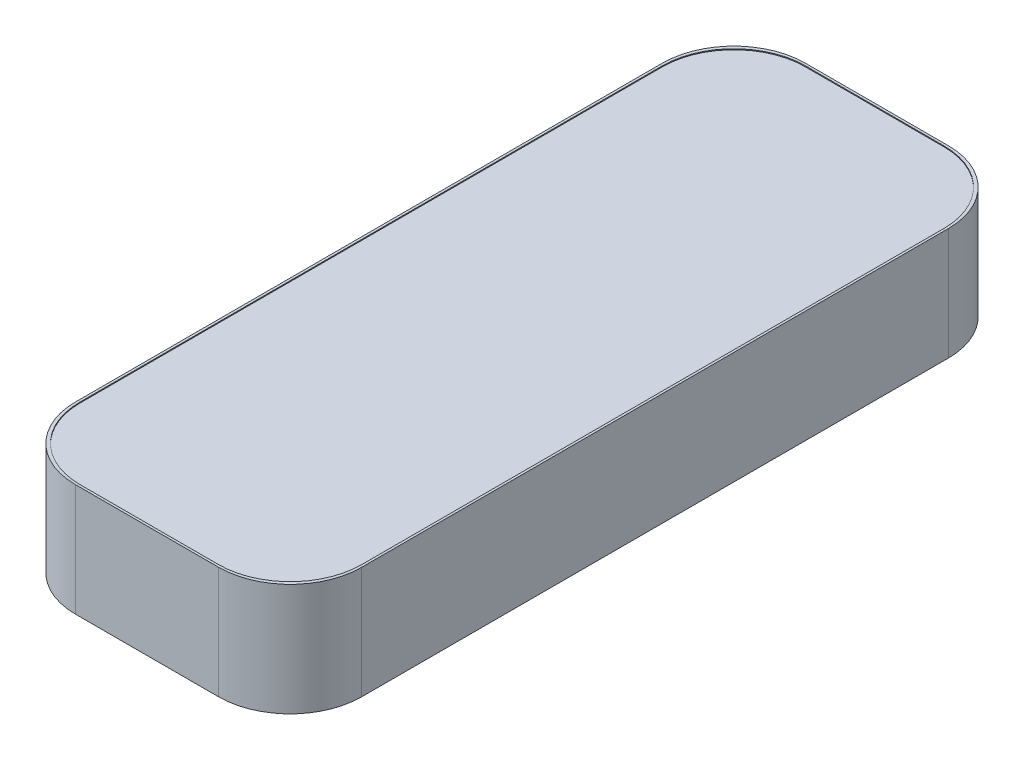
ISO-10303-21;
HEADER;
FILE_DESCRIPTION(('STEP AP214'),'2;1');
FILE_NAME('part.step','',(''),(''),'','','');
FILE_SCHEMA(('AUTOMOTIVE_DESIGN { 1 0 10303 214 1 1 1 1 }'));
ENDSEC;
DATA;
#1=APPLICATION_CONTEXT('core data for automotive mechanical design processes');
#2=APPLICATION_PROTOCOL_DEFINITION('international standard','automotive_design',2000,#1);
#3=PRODUCT_CONTEXT('',#1,'mechanical');
#4=PRODUCT('Part','Part','',(#3));
#5=PRODUCT_RELATED_PRODUCT_CATEGORY('part','',(#4));
#6=PRODUCT_DEFINITION_FORMATION('','',#4);
#7=PRODUCT_DEFINITION_CONTEXT('part definition',#1,'design');
#8=PRODUCT_DEFINITION('design','',#6,#7);
#9=PRODUCT_DEFINITION_SHAPE('','',#8);
#10=(LENGTH_UNIT() NAMED_UNIT(*) SI_UNIT(.MILLI.,.METRE.));
#11=(NAMED_UNIT(*) PLANE_ANGLE_UNIT() SI_UNIT($,.RADIAN.));
#12=(NAMED_UNIT(*) SI_UNIT($,.STERADIAN.) SOLID_ANGLE_UNIT());
#13=UNCERTAINTY_MEASURE_WITH_UNIT(LENGTH_MEASURE(1.E-05),#10,'distance_accuracy_value','');
#14=(GEOMETRIC_REPRESENTATION_CONTEXT(3) GLOBAL_UNCERTAINTY_ASSIGNED_CONTEXT((#13)) GLOBAL_UNIT_ASSIGNED_CONTEXT((#10,
#11,#12)) REPRESENTATION_CONTEXT('',''));
#15=CARTESIAN_POINT('',(0.,0.,0.));
#16=DIRECTION('',(0.,0.,1.));
#17=DIRECTION('',(1.,0.,0.));
#18=AXIS2_PLACEMENT_3D('',#15,#16,#17);
#19=CARTESIAN_POINT('',(-15.875,0.,-40.48125));
#20=DIRECTION('',(0.,-1.,0.));
#21=DIRECTION('',(0.,0.,-1.));
#22=AXIS2_PLACEMENT_3D('',#19,#20,#21);
#23=PLANE('',#22);
#24=DIRECTION('',(1.,0.,0.));
#25=VECTOR('',#24,1.);
#26=CARTESIAN_POINT('',(-23.8125,0.,0.));
#27=LINE('',#26,#25);
#28=CARTESIAN_POINT('',(-23.8125,0.,0.));
#29=VERTEX_POINT('',#28);
#30=CARTESIAN_POINT('',(-7.9375,0.,0.));
#31=VERTEX_POINT('',#30);
#32=EDGE_CURVE('E26',#29,#31,#27,.T.);
#33=ORIENTED_EDGE('',*,*,#32,.F.);
#34=CARTESIAN_POINT('',(-23.8125,0.,-7.9375));
#35=DIRECTION('',(0.,1.,0.));
#36=DIRECTION('',(-1.,0.,0.));
#37=AXIS2_PLACEMENT_3D('',#34,#35,#36);
#38=CIRCLE('',#37,7.9375);
#39=CARTESIAN_POINT('',(-31.75,0.,-7.9375));
#40=VERTEX_POINT('',#39);
#41=EDGE_CURVE('E278',#40,#29,#38,.T.);
#42=ORIENTED_EDGE('',*,*,#41,.F.);
#43=DIRECTION('',(0.,0.,1.));
#44=VECTOR('',#43,1.);
#45=CARTESIAN_POINT('',(-31.75,0.,-73.025));
#46=LINE('',#45,#44);
#47=CARTESIAN_POINT('',(-31.75,0.,-73.025));
#48=VERTEX_POINT('',#47);
#49=EDGE_CURVE('E322',#48,#40,#46,.T.);
#50=ORIENTED_EDGE('',*,*,#49,.F.);
#51=CARTESIAN_POINT('',(-23.8125,0.,-73.025));
#52=DIRECTION('',(0.,1.,0.));
#53=DIRECTION('',(0.,0.,-1.));
#54=AXIS2_PLACEMENT_3D('',#51,#52,#53);
#55=CIRCLE('',#54,7.9375);
#56=CARTESIAN_POINT('',(-23.8125,0.,-80.9625));
#57=VERTEX_POINT('',#56);
#58=EDGE_CURVE('E223',#57,#48,#55,.T.);
#59=ORIENTED_EDGE('',*,*,#58,.F.);
#60=DIRECTION('',(-1.,0.,0.));
#61=VECTOR('',#60,1.);
#62=CARTESIAN_POINT('',(-7.9375,0.,-80.9625));
#63=LINE('',#62,#61);
#64=CARTESIAN_POINT('',(-7.9375,0.,-80.9625));
#65=VERTEX_POINT('',#64);
#66=EDGE_CURVE('E215',#65,#57,#63,.T.);
#67=ORIENTED_EDGE('',*,*,#66,.F.);
#68=CARTESIAN_POINT('',(-7.9375,0.,-73.025));
#69=DIRECTION('',(0.,1.,0.));
#70=DIRECTION('',(1.,0.,0.));
#71=AXIS2_PLACEMENT_3D('',#68,#69,#70);
#72=CIRCLE('',#71,7.9375);
#73=CARTESIAN_POINT('',(0.,0.,-73.025));
#74=VERTEX_POINT('',#73);
#75=EDGE_CURVE('E198',#74,#65,#72,.T.);
#76=ORIENTED_EDGE('',*,*,#75,.F.);
#77=DIRECTION('',(0.,0.,-1.));
#78=VECTOR('',#77,1.);
#79=CARTESIAN_POINT('',(0.,0.,-7.9375));
#80=LINE('',#79,#78);
#81=CARTESIAN_POINT('',(0.,0.,-7.9375));
#82=VERTEX_POINT('',#81);
#83=EDGE_CURVE('E332',#82,#74,#80,.T.);
#84=ORIENTED_EDGE('',*,*,#83,.F.);
#85=CARTESIAN_POINT('',(-7.9375,0.,-7.9375));
#86=DIRECTION('',(0.,1.,0.));
#87=DIRECTION('',(0.,0.,1.));
#88=AXIS2_PLACEMENT_3D('',#85,#86,#87);
#89=CIRCLE('',#88,7.9375);
#90=EDGE_CURVE('E248',#31,#82,#89,.T.);
#91=ORIENTED_EDGE('',*,*,#90,.F.);
#92=EDGE_LOOP('',(#33,#42,#50,#59,#67,#76,#84,#91));
#93=FACE_BOUND('',#92,.T.);
#94=CARTESIAN_POINT('',(-23.5585,0.,-8.1915));
#95=DIRECTION('',(0.,1.,0.));
#96=DIRECTION('',(0.,0.,-1.));
#97=AXIS2_PLACEMENT_3D('',#94,#95,#96);
#98=CIRCLE('',#97,7.9375);
#99=CARTESIAN_POINT('',(-31.496,0.,-8.1915));
#100=VERTEX_POINT('',#99);
#101=CARTESIAN_POINT('',(-23.5585,0.,-0.253999999999995));
#102=VERTEX_POINT('',#101);
#103=EDGE_CURVE('E351',#100,#102,#98,.T.);
#104=ORIENTED_EDGE('',*,*,#103,.T.);
#105=DIRECTION('',(1.,0.,0.));
#106=VECTOR('',#105,1.);
#107=CARTESIAN_POINT('',(-12.03325,0.,-0.253999999999995));
#108=LINE('',#107,#106);
#109=CARTESIAN_POINT('',(-8.1915,0.,-0.253999999999995));
#110=VERTEX_POINT('',#109);
#111=EDGE_CURVE('E342',#102,#110,#108,.T.);
#112=ORIENTED_EDGE('',*,*,#111,.T.);
#113=CARTESIAN_POINT('',(-8.1915,0.,-8.1915));
#114=DIRECTION('',(0.,1.,0.));
#115=DIRECTION('',(-1.,0.,0.));
#116=AXIS2_PLACEMENT_3D('',#113,#114,#115);
#117=CIRCLE('',#116,7.9375);
#118=CARTESIAN_POINT('',(-0.254,0.,-8.1915));
#119=VERTEX_POINT('',#118);
#120=EDGE_CURVE('E284',#110,#119,#117,.T.);
#121=ORIENTED_EDGE('',*,*,#120,.T.);
#122=DIRECTION('',(0.,0.,-1.));
#123=VECTOR('',#122,1.);
#124=CARTESIAN_POINT('',(-0.254,0.,-56.626125));
#125=LINE('',#124,#123);
#126=CARTESIAN_POINT('',(-0.254,0.,-72.771));
#127=VERTEX_POINT('',#126);
#128=EDGE_CURVE('E257',#119,#127,#125,.T.);
#129=ORIENTED_EDGE('',*,*,#128,.T.);
#130=CARTESIAN_POINT('',(-8.1915,0.,-72.771));
#131=DIRECTION('',(0.,1.,0.));
#132=DIRECTION('',(0.,0.,1.));
#133=AXIS2_PLACEMENT_3D('',#130,#131,#132);
#134=CIRCLE('',#133,7.9375);
#135=CARTESIAN_POINT('',(-8.1915,0.,-80.7085));
#136=VERTEX_POINT('',#135);
#137=EDGE_CURVE('E236',#127,#136,#134,.T.);
#138=ORIENTED_EDGE('',*,*,#137,.T.);
#139=DIRECTION('',(-1.,0.,0.));
#140=VECTOR('',#139,1.);
#141=CARTESIAN_POINT('',(-19.71675,0.,-80.7085));
#142=LINE('',#141,#140);
#143=CARTESIAN_POINT('',(-23.5585,0.,-80.7085));
#144=VERTEX_POINT('',#143);
#145=EDGE_CURVE('E301',#136,#144,#142,.T.);
#146=ORIENTED_EDGE('',*,*,#145,.T.);
#147=CARTESIAN_POINT('',(-23.5585,0.,-72.771));
#148=DIRECTION('',(0.,1.,0.));
#149=DIRECTION('',(1.,0.,0.));
#150=AXIS2_PLACEMENT_3D('',#147,#148,#149);
#151=CIRCLE('',#150,7.9375);
#152=CARTESIAN_POINT('',(-31.496,0.,-72.771));
#153=VERTEX_POINT('',#152);
#154=EDGE_CURVE('E317',#144,#153,#151,.T.);
#155=ORIENTED_EDGE('',*,*,#154,.T.);
#156=DIRECTION('',(0.,0.,1.));
#157=VECTOR('',#156,1.);
#158=CARTESIAN_POINT('',(-31.496,0.,-24.336375));
#159=LINE('',#158,#157);
#160=EDGE_CURVE('E258',#153,#100,#159,.T.);
#161=ORIENTED_EDGE('',*,*,#160,.T.);
#162=EDGE_LOOP('',(#104,#112,#121,#129,#138,#146,#155,#161));
#163=FACE_BOUND('',#162,.T.);
#164=ADVANCED_FACE('F15',(#93,#163),#23,.T.);
#165=CARTESIAN_POINT('',(-15.875,12.446,-40.48125));
#166=DIRECTION('',(0.,-1.,0.));
#167=DIRECTION('',(0.,0.,-1.));
#168=AXIS2_PLACEMENT_3D('',#165,#166,#167);
#169=PLANE('',#168);
#170=DIRECTION('',(1.,0.,0.));
#171=VECTOR('',#170,1.);
#172=CARTESIAN_POINT('',(-23.8125,12.446,0.));
#173=LINE('',#172,#171);
#174=CARTESIAN_POINT('',(-23.8125,12.446,0.));
#175=VERTEX_POINT('',#174);
#176=CARTESIAN_POINT('',(-7.9375,12.446,0.));
#177=VERTEX_POINT('',#176);
#178=EDGE_CURVE('E10',#175,#177,#173,.T.);
#179=ORIENTED_EDGE('',*,*,#178,.T.);
#180=CARTESIAN_POINT('',(-7.9375,12.446,-7.9375));
#181=DIRECTION('',(0.,1.,0.));
#182=DIRECTION('',(0.,0.,1.));
#183=AXIS2_PLACEMENT_3D('',#180,#181,#182);
#184=CIRCLE('',#183,7.9375);
#185=CARTESIAN_POINT('',(0.,12.446,-7.9375));
#186=VERTEX_POINT('',#185);
#187=EDGE_CURVE('E245',#177,#186,#184,.T.);
#188=ORIENTED_EDGE('',*,*,#187,.T.);
#189=DIRECTION('',(0.,0.,-1.));
#190=VECTOR('',#189,1.);
#191=CARTESIAN_POINT('',(0.,12.446,-7.9375));
#192=LINE('',#191,#190);
#193=CARTESIAN_POINT('',(0.,12.446,-73.025));
#194=VERTEX_POINT('',#193);
#195=EDGE_CURVE('E384',#186,#194,#192,.T.);
#196=ORIENTED_EDGE('',*,*,#195,.T.);
#197=CARTESIAN_POINT('',(-7.9375,12.446,-73.025));
#198=DIRECTION('',(0.,1.,0.));
#199=DIRECTION('',(1.,0.,0.));
#200=AXIS2_PLACEMENT_3D('',#197,#198,#199);
#201=CIRCLE('',#200,7.9375);
#202=CARTESIAN_POINT('',(-7.9375,12.446,-80.9625));
#203=VERTEX_POINT('',#202);
#204=EDGE_CURVE('E210',#194,#203,#201,.T.);
#205=ORIENTED_EDGE('',*,*,#204,.T.);
#206=DIRECTION('',(-1.,0.,0.));
#207=VECTOR('',#206,1.);
#208=CARTESIAN_POINT('',(-7.9375,12.446,-80.9625));
#209=LINE('',#208,#207);
#210=CARTESIAN_POINT('',(-23.8125,12.446,-80.9625));
#211=VERTEX_POINT('',#210);
#212=EDGE_CURVE('E217',#203,#211,#209,.T.);
#213=ORIENTED_EDGE('',*,*,#212,.T.);
#214=CARTESIAN_POINT('',(-23.8125,12.446,-73.025));
#215=DIRECTION('',(0.,1.,0.));
#216=DIRECTION('',(0.,0.,-1.));
#217=AXIS2_PLACEMENT_3D('',#214,#215,#216);
#218=CIRCLE('',#217,7.9375);
#219=CARTESIAN_POINT('',(-31.75,12.446,-73.025));
#220=VERTEX_POINT('',#219);
#221=EDGE_CURVE('E233',#211,#220,#218,.T.);
#222=ORIENTED_EDGE('',*,*,#221,.T.);
#223=DIRECTION('',(0.,0.,1.));
#224=VECTOR('',#223,1.);
#225=CARTESIAN_POINT('',(-31.75,12.446,-73.025));
#226=LINE('',#225,#224);
#227=CARTESIAN_POINT('',(-31.75,12.446,-7.9375));
#228=VERTEX_POINT('',#227);
#229=EDGE_CURVE('E318',#220,#228,#226,.T.);
#230=ORIENTED_EDGE('',*,*,#229,.T.);
#231=CARTESIAN_POINT('',(-23.8125,12.446,-7.9375));
#232=DIRECTION('',(0.,1.,0.));
#233=DIRECTION('',(-1.,0.,0.));
#234=AXIS2_PLACEMENT_3D('',#231,#232,#233);
#235=CIRCLE('',#234,7.9375);
#236=EDGE_CURVE('E392',#228,#175,#235,.T.);
#237=ORIENTED_EDGE('',*,*,#236,.T.);
#238=EDGE_LOOP('',(#179,#188,#196,#205,#213,#222,#230,#237));
#239=FACE_BOUND('',#238,.T.);
#240=CARTESIAN_POINT('',(-23.5585,12.446,-72.771));
#241=DIRECTION('',(0.,-1.,0.));
#242=DIRECTION('',(0.,0.,-1.));
#243=AXIS2_PLACEMENT_3D('',#240,#241,#242);
#244=CIRCLE('',#243,7.9375);
#245=CARTESIAN_POINT('',(-31.496,12.446,-72.771));
#246=VERTEX_POINT('',#245);
#247=CARTESIAN_POINT('',(-23.5585,12.446,-80.7085));
#248=VERTEX_POINT('',#247);
#249=EDGE_CURVE('E307',#246,#248,#244,.T.);
#250=ORIENTED_EDGE('',*,*,#249,.T.);
#251=DIRECTION('',(1.,0.,0.));
#252=VECTOR('',#251,1.);
#253=CARTESIAN_POINT('',(-19.71675,12.446,-80.7085));
#254=LINE('',#253,#252);
#255=CARTESIAN_POINT('',(-8.1915,12.446,-80.7085));
#256=VERTEX_POINT('',#255);
#257=EDGE_CURVE('E252',#248,#256,#254,.T.);
#258=ORIENTED_EDGE('',*,*,#257,.T.);
#259=CARTESIAN_POINT('',(-8.1915,12.446,-72.771));
#260=DIRECTION('',(0.,-1.,0.));
#261=DIRECTION('',(1.,0.,0.));
#262=AXIS2_PLACEMENT_3D('',#259,#260,#261);
#263=CIRCLE('',#262,7.9375);
#264=CARTESIAN_POINT('',(-0.254,12.446,-72.771));
#265=VERTEX_POINT('',#264);
#266=EDGE_CURVE('E364',#256,#265,#263,.T.);
#267=ORIENTED_EDGE('',*,*,#266,.T.);
#268=DIRECTION('',(0.,0.,1.));
#269=VECTOR('',#268,1.);
#270=CARTESIAN_POINT('',(-0.254,12.446,-56.626125));
#271=LINE('',#270,#269);
#272=CARTESIAN_POINT('',(-0.254,12.446,-8.1915));
#273=VERTEX_POINT('',#272);
#274=EDGE_CURVE('E152',#265,#273,#271,.T.);
#275=ORIENTED_EDGE('',*,*,#274,.T.);
#276=CARTESIAN_POINT('',(-8.1915,12.446,-8.1915));
#277=DIRECTION('',(0.,-1.,0.));
#278=DIRECTION('',(0.,0.,1.));
#279=AXIS2_PLACEMENT_3D('',#276,#277,#278);
#280=CIRCLE('',#279,7.9375);
#281=CARTESIAN_POINT('',(-8.1915,12.446,-0.254));
#282=VERTEX_POINT('',#281);
#283=EDGE_CURVE('E405',#273,#282,#280,.T.);
#284=ORIENTED_EDGE('',*,*,#283,.T.);
#285=DIRECTION('',(-1.,0.,0.));
#286=VECTOR('',#285,1.);
#287=CARTESIAN_POINT('',(-12.03325,12.446,-0.254));
#288=LINE('',#287,#286);
#289=CARTESIAN_POINT('',(-23.5585,12.446,-0.254));
#290=VERTEX_POINT('',#289);
#291=EDGE_CURVE('E325',#282,#290,#288,.T.);
#292=ORIENTED_EDGE('',*,*,#291,.T.);
#293=CARTESIAN_POINT('',(-23.5585,12.446,-8.1915));
#294=DIRECTION('',(0.,-1.,0.));
#295=DIRECTION('',(-1.,0.,0.));
#296=AXIS2_PLACEMENT_3D('',#293,#294,#295);
#297=CIRCLE('',#296,7.9375);
#298=CARTESIAN_POINT('',(-31.496,12.446,-8.1915));
#299=VERTEX_POINT('',#298);
#300=EDGE_CURVE('E241',#290,#299,#297,.T.);
#301=ORIENTED_EDGE('',*,*,#300,.T.);
#302=DIRECTION('',(0.,0.,-1.));
#303=VECTOR('',#302,1.);
#304=CARTESIAN_POINT('',(-31.496,12.446,-24.336375));
#305=LINE('',#304,#303);
#306=EDGE_CURVE('E352',#299,#246,#305,.T.);
#307=ORIENTED_EDGE('',*,*,#306,.T.);
#308=EDGE_LOOP('',(#250,#258,#267,#275,#284,#292,#301,#307));
#309=FACE_BOUND('',#308,.T.);
#310=ADVANCED_FACE('F478',(#239,#309),#169,.F.);
#311=CARTESIAN_POINT('',(-23.8125,0.,0.));
#312=DIRECTION('',(0.,0.,1.));
#313=DIRECTION('',(1.,0.,0.));
#314=AXIS2_PLACEMENT_3D('',#311,#312,#313);
#315=PLANE('',#314);
#316=ORIENTED_EDGE('',*,*,#32,.T.);
#317=DIRECTION('',(0.,1.,0.));
#318=VECTOR('',#317,1.);
#319=CARTESIAN_POINT('',(-7.9375,0.,0.));
#320=LINE('',#319,#318);
#321=EDGE_CURVE('E247',#31,#177,#320,.T.);
#322=ORIENTED_EDGE('',*,*,#321,.T.);
#323=ORIENTED_EDGE('',*,*,#178,.F.);
#324=DIRECTION('',(0.,1.,0.));
#325=VECTOR('',#324,1.);
#326=CARTESIAN_POINT('',(-23.8125,0.,0.));
#327=LINE('',#326,#325);
#328=EDGE_CURVE('E282',#29,#175,#327,.T.);
#329=ORIENTED_EDGE('',*,*,#328,.F.);
#330=EDGE_LOOP('',(#316,#322,#323,#329));
#331=FACE_BOUND('',#330,.T.);
#332=ADVANCED_FACE('F518',(#331),#315,.T.);
#333=CARTESIAN_POINT('',(-7.9375,0.,-7.9375));
#334=DIRECTION('',(0.,-1.,0.));
#335=DIRECTION('',(0.,0.,1.));
#336=AXIS2_PLACEMENT_3D('',#333,#334,#335);
#337=CYLINDRICAL_SURFACE('',#336,7.9375);
#338=ORIENTED_EDGE('',*,*,#90,.T.);
#339=DIRECTION('',(0.,1.,0.));
#340=VECTOR('',#339,1.);
#341=CARTESIAN_POINT('',(0.,0.,-7.9375));
#342=LINE('',#341,#340);
#343=EDGE_CURVE('E268',#82,#186,#342,.T.);
#344=ORIENTED_EDGE('',*,*,#343,.T.);
#345=ORIENTED_EDGE('',*,*,#187,.F.);
#346=ORIENTED_EDGE('',*,*,#321,.F.);
#347=EDGE_LOOP('',(#338,#344,#345,#346));
#348=FACE_BOUND('',#347,.T.);
#349=ADVANCED_FACE('F524',(#348),#337,.T.);
#350=CARTESIAN_POINT('',(0.,0.,-7.9375));
#351=DIRECTION('',(1.,0.,0.));
#352=DIRECTION('',(0.,0.,-1.));
#353=AXIS2_PLACEMENT_3D('',#350,#351,#352);
#354=PLANE('',#353);
#355=ORIENTED_EDGE('',*,*,#83,.T.);
#356=DIRECTION('',(0.,1.,0.));
#357=VECTOR('',#356,1.);
#358=CARTESIAN_POINT('',(0.,0.,-73.025));
#359=LINE('',#358,#357);
#360=EDGE_CURVE('E205',#74,#194,#359,.T.);
#361=ORIENTED_EDGE('',*,*,#360,.T.);
#362=ORIENTED_EDGE('',*,*,#195,.F.);
#363=ORIENTED_EDGE('',*,*,#343,.F.);
#364=EDGE_LOOP('',(#355,#361,#362,#363));
#365=FACE_BOUND('',#364,.T.);
#366=ADVANCED_FACE('F691',(#365),#354,.T.);
#367=CARTESIAN_POINT('',(-7.9375,0.,-73.025));
#368=DIRECTION('',(0.,-1.,0.));
#369=DIRECTION('',(1.,0.,0.));
#370=AXIS2_PLACEMENT_3D('',#367,#368,#369);
#371=CYLINDRICAL_SURFACE('',#370,7.9375);
#372=ORIENTED_EDGE('',*,*,#75,.T.);
#373=DIRECTION('',(0.,1.,0.));
#374=VECTOR('',#373,1.);
#375=CARTESIAN_POINT('',(-7.9375,0.,-80.9625));
#376=LINE('',#375,#374);
#377=EDGE_CURVE('E202',#65,#203,#376,.T.);
#378=ORIENTED_EDGE('',*,*,#377,.T.);
#379=ORIENTED_EDGE('',*,*,#204,.F.);
#380=ORIENTED_EDGE('',*,*,#360,.F.);
#381=EDGE_LOOP('',(#372,#378,#379,#380));
#382=FACE_BOUND('',#381,.T.);
#383=ADVANCED_FACE('F200',(#382),#371,.T.);
#384=CARTESIAN_POINT('',(-7.9375,0.,-80.9625));
#385=DIRECTION('',(0.,0.,-1.));
#386=DIRECTION('',(-1.,0.,0.));
#387=AXIS2_PLACEMENT_3D('',#384,#385,#386);
#388=PLANE('',#387);
#389=ORIENTED_EDGE('',*,*,#66,.T.);
#390=DIRECTION('',(0.,1.,0.));
#391=VECTOR('',#390,1.);
#392=CARTESIAN_POINT('',(-23.8125,0.,-80.9625));
#393=LINE('',#392,#391);
#394=EDGE_CURVE('E225',#57,#211,#393,.T.);
#395=ORIENTED_EDGE('',*,*,#394,.T.);
#396=ORIENTED_EDGE('',*,*,#212,.F.);
#397=ORIENTED_EDGE('',*,*,#377,.F.);
#398=EDGE_LOOP('',(#389,#395,#396,#397));
#399=FACE_BOUND('',#398,.T.);
#400=ADVANCED_FACE('F213',(#399),#388,.T.);
#401=CARTESIAN_POINT('',(-23.8125,0.,-73.025));
#402=DIRECTION('',(0.,-1.,0.));
#403=DIRECTION('',(0.,0.,-1.));
#404=AXIS2_PLACEMENT_3D('',#401,#402,#403);
#405=CYLINDRICAL_SURFACE('',#404,7.9375);
#406=ORIENTED_EDGE('',*,*,#58,.T.);
#407=DIRECTION('',(0.,1.,0.));
#408=VECTOR('',#407,1.);
#409=CARTESIAN_POINT('',(-31.75,0.,-73.025));
#410=LINE('',#409,#408);
#411=EDGE_CURVE('E321',#48,#220,#410,.T.);
#412=ORIENTED_EDGE('',*,*,#411,.T.);
#413=ORIENTED_EDGE('',*,*,#221,.F.);
#414=ORIENTED_EDGE('',*,*,#394,.F.);
#415=EDGE_LOOP('',(#406,#412,#413,#414));
#416=FACE_BOUND('',#415,.T.);
#417=ADVANCED_FACE('F625',(#416),#405,.T.);
#418=CARTESIAN_POINT('',(-31.75,0.,-73.025));
#419=DIRECTION('',(-1.,0.,0.));
#420=DIRECTION('',(0.,0.,1.));
#421=AXIS2_PLACEMENT_3D('',#418,#419,#420);
#422=PLANE('',#421);
#423=ORIENTED_EDGE('',*,*,#49,.T.);
#424=DIRECTION('',(0.,1.,0.));
#425=VECTOR('',#424,1.);
#426=CARTESIAN_POINT('',(-31.75,0.,-7.9375));
#427=LINE('',#426,#425);
#428=EDGE_CURVE('E427',#40,#228,#427,.T.);
#429=ORIENTED_EDGE('',*,*,#428,.T.);
#430=ORIENTED_EDGE('',*,*,#229,.F.);
#431=ORIENTED_EDGE('',*,*,#411,.F.);
#432=EDGE_LOOP('',(#423,#429,#430,#431));
#433=FACE_BOUND('',#432,.T.);
#434=DIRECTION('',(0.,0.,-1.));
#435=VECTOR('',#434,1.);
#436=CARTESIAN_POINT('',(-31.75,5.08,-43.6414119668617));
#437=LINE('',#436,#435);
#438=CARTESIAN_POINT('',(-31.75,5.08,-14.2578239337234));
#439=VERTEX_POINT('',#438);
#440=CARTESIAN_POINT('',(-31.75,5.08,-19.0203239337234));
#441=VERTEX_POINT('',#440);
#442=EDGE_CURVE('E334',#439,#441,#437,.T.);
#443=ORIENTED_EDGE('',*,*,#442,.T.);
#444=CARTESIAN_POINT('',(-31.75,5.87375,-19.0203239337234));
#445=DIRECTION('',(1.,0.,0.));
#446=DIRECTION('',(0.,-1.,0.));
#447=AXIS2_PLACEMENT_3D('',#444,#445,#446);
#448=CIRCLE('',#447,0.793749999999989);
#449=CARTESIAN_POINT('',(-31.75,6.6675,-19.0203239337234));
#450=VERTEX_POINT('',#449);
#451=EDGE_CURVE('E347',#441,#450,#448,.T.);
#452=ORIENTED_EDGE('',*,*,#451,.T.);
#453=DIRECTION('',(0.,0.,1.));
#454=VECTOR('',#453,1.);
#455=CARTESIAN_POINT('',(-31.75,6.6675,-46.0226619668617));
#456=LINE('',#455,#454);
#457=CARTESIAN_POINT('',(-31.75,6.6675,-14.2578239337234));
#458=VERTEX_POINT('',#457);
#459=EDGE_CURVE('E276',#450,#458,#456,.T.);
#460=ORIENTED_EDGE('',*,*,#459,.T.);
#461=CARTESIAN_POINT('',(-31.75,5.87375,-14.2578239337234));
#462=DIRECTION('',(1.,0.,0.));
#463=DIRECTION('',(0.,0.,-1.));
#464=AXIS2_PLACEMENT_3D('',#461,#462,#463);
#465=CIRCLE('',#464,0.793749999999989);
#466=EDGE_CURVE('E262',#458,#439,#465,.T.);
#467=ORIENTED_EDGE('',*,*,#466,.T.);
#468=EDGE_LOOP('',(#443,#452,#460,#467));
#469=FACE_BOUND('',#468,.T.);
#470=ADVANCED_FACE('F616',(#433,#469),#422,.T.);
#471=CARTESIAN_POINT('',(-23.8125,0.,-7.9375));
#472=DIRECTION('',(0.,-1.,0.));
#473=DIRECTION('',(-1.,0.,0.));
#474=AXIS2_PLACEMENT_3D('',#471,#472,#473);
#475=CYLINDRICAL_SURFACE('',#474,7.9375);
#476=ORIENTED_EDGE('',*,*,#41,.T.);
#477=ORIENTED_EDGE('',*,*,#328,.T.);
#478=ORIENTED_EDGE('',*,*,#236,.F.);
#479=ORIENTED_EDGE('',*,*,#428,.F.);
#480=EDGE_LOOP('',(#476,#477,#478,#479));
#481=FACE_BOUND('',#480,.T.);
#482=ADVANCED_FACE('F611',(#481),#475,.T.);
#483=CARTESIAN_POINT('',(-15.875,12.3444,-40.48125));
#484=DIRECTION('',(0.,1.,0.));
#485=DIRECTION('',(0.,0.,1.));
#486=AXIS2_PLACEMENT_3D('',#483,#484,#485);
#487=PLANE('',#486);
#488=DIRECTION('',(1.,0.,0.));
#489=VECTOR('',#488,1.);
#490=CARTESIAN_POINT('',(-8.1915,12.3444,-80.7085));
#491=LINE('',#490,#489);
#492=CARTESIAN_POINT('',(-23.5585,12.3444,-80.7085));
#493=VERTEX_POINT('',#492);
#494=CARTESIAN_POINT('',(-8.1915,12.3444,-80.7085));
#495=VERTEX_POINT('',#494);
#496=EDGE_CURVE('E283',#493,#495,#491,.T.);
#497=ORIENTED_EDGE('',*,*,#496,.F.);
#498=CARTESIAN_POINT('',(-23.5585,12.3444,-72.771));
#499=DIRECTION('',(0.,-1.,0.));
#500=DIRECTION('',(0.,0.,-1.));
#501=AXIS2_PLACEMENT_3D('',#498,#499,#500);
#502=CIRCLE('',#501,7.9375);
#503=CARTESIAN_POINT('',(-31.496,12.3444,-72.771));
#504=VERTEX_POINT('',#503);
#505=EDGE_CURVE('E306',#504,#493,#502,.T.);
#506=ORIENTED_EDGE('',*,*,#505,.F.);
#507=DIRECTION('',(0.,0.,-1.));
#508=VECTOR('',#507,1.);
#509=CARTESIAN_POINT('',(-31.496,12.3444,-72.771));
#510=LINE('',#509,#508);
#511=CARTESIAN_POINT('',(-31.496,12.3444,-8.1915));
#512=VERTEX_POINT('',#511);
#513=EDGE_CURVE('E244',#512,#504,#510,.T.);
#514=ORIENTED_EDGE('',*,*,#513,.F.);
#515=CARTESIAN_POINT('',(-23.5585,12.3444,-8.1915));
#516=DIRECTION('',(0.,-1.,0.));
#517=DIRECTION('',(-1.,0.,0.));
#518=AXIS2_PLACEMENT_3D('',#515,#516,#517);
#519=CIRCLE('',#518,7.9375);
#520=CARTESIAN_POINT('',(-23.5585,12.3444,-0.253999999999995));
#521=VERTEX_POINT('',#520);
#522=EDGE_CURVE('E327',#521,#512,#519,.T.);
#523=ORIENTED_EDGE('',*,*,#522,.F.);
#524=DIRECTION('',(-1.,0.,0.));
#525=VECTOR('',#524,1.);
#526=CARTESIAN_POINT('',(-23.5585,12.3444,-0.254));
#527=LINE('',#526,#525);
#528=CARTESIAN_POINT('',(-8.1915,12.3444,-0.253999999999995));
#529=VERTEX_POINT('',#528);
#530=EDGE_CURVE('E406',#529,#521,#527,.T.);
#531=ORIENTED_EDGE('',*,*,#530,.F.);
#532=CARTESIAN_POINT('',(-8.1915,12.3444,-8.1915));
#533=DIRECTION('',(0.,-1.,0.));
#534=DIRECTION('',(0.,0.,1.));
#535=AXIS2_PLACEMENT_3D('',#532,#533,#534);
#536=CIRCLE('',#535,7.9375);
#537=CARTESIAN_POINT('',(-0.254,12.3444,-8.1915));
#538=VERTEX_POINT('',#537);
#539=EDGE_CURVE('E160',#538,#529,#536,.T.);
#540=ORIENTED_EDGE('',*,*,#539,.F.);
#541=DIRECTION('',(0.,0.,1.));
#542=VECTOR('',#541,1.);
#543=CARTESIAN_POINT('',(-0.254,12.3444,-8.1915));
#544=LINE('',#543,#542);
#545=CARTESIAN_POINT('',(-0.254,12.3444,-72.771));
#546=VERTEX_POINT('',#545);
#547=EDGE_CURVE('E312',#546,#538,#544,.T.);
#548=ORIENTED_EDGE('',*,*,#547,.F.);
#549=CARTESIAN_POINT('',(-8.1915,12.3444,-72.771));
#550=DIRECTION('',(0.,-1.,0.));
#551=DIRECTION('',(1.,0.,0.));
#552=AXIS2_PLACEMENT_3D('',#549,#550,#551);
#553=CIRCLE('',#552,7.9375);
#554=EDGE_CURVE('E249',#495,#546,#553,.T.);
#555=ORIENTED_EDGE('',*,*,#554,.F.);
#556=EDGE_LOOP('',(#497,#506,#514,#523,#531,#540,#548,#555));
#557=FACE_BOUND('',#556,.T.);
#558=ADVANCED_FACE('F511',(#557),#487,.T.);
#559=CARTESIAN_POINT('',(-23.5585,12.446,-80.7085));
#560=DIRECTION('',(0.,0.,-1.));
#561=DIRECTION('',(1.,0.,0.));
#562=AXIS2_PLACEMENT_3D('',#559,#560,#561);
#563=PLANE('',#562);
#564=ORIENTED_EDGE('',*,*,#257,.F.);
#565=DIRECTION('',(0.,-1.,0.));
#566=VECTOR('',#565,1.);
#567=CARTESIAN_POINT('',(-23.5585,12.446,-80.7085));
#568=LINE('',#567,#566);
#569=EDGE_CURVE('E354',#248,#493,#568,.T.);
#570=ORIENTED_EDGE('',*,*,#569,.T.);
#571=ORIENTED_EDGE('',*,*,#496,.T.);
#572=DIRECTION('',(0.,-1.,0.));
#573=VECTOR('',#572,1.);
#574=CARTESIAN_POINT('',(-8.1915,12.446,-80.7085));
#575=LINE('',#574,#573);
#576=EDGE_CURVE('E253',#256,#495,#575,.T.);
#577=ORIENTED_EDGE('',*,*,#576,.F.);
#578=EDGE_LOOP('',(#564,#570,#571,#577));
#579=FACE_BOUND('',#578,.T.);
#580=ADVANCED_FACE('F509',(#579),#563,.F.);
#581=CARTESIAN_POINT('',(-8.1915,12.446,-72.771));
#582=DIRECTION('',(0.,1.,0.));
#583=DIRECTION('',(1.,0.,0.));
#584=AXIS2_PLACEMENT_3D('',#581,#582,#583);
#585=CYLINDRICAL_SURFACE('',#584,7.9375);
#586=ORIENTED_EDGE('',*,*,#266,.F.);
#587=ORIENTED_EDGE('',*,*,#576,.T.);
#588=ORIENTED_EDGE('',*,*,#554,.T.);
#589=DIRECTION('',(0.,-1.,0.));
#590=VECTOR('',#589,1.);
#591=CARTESIAN_POINT('',(-0.254,12.446,-72.771));
#592=LINE('',#591,#590);
#593=EDGE_CURVE('E308',#265,#546,#592,.T.);
#594=ORIENTED_EDGE('',*,*,#593,.F.);
#595=EDGE_LOOP('',(#586,#587,#588,#594));
#596=FACE_BOUND('',#595,.T.);
#597=ADVANCED_FACE('F481',(#596),#585,.F.);
#598=CARTESIAN_POINT('',(-0.254,12.446,-72.771));
#599=DIRECTION('',(1.,0.,0.));
#600=DIRECTION('',(0.,0.,1.));
#601=AXIS2_PLACEMENT_3D('',#598,#599,#600);
#602=PLANE('',#601);
#603=ORIENTED_EDGE('',*,*,#274,.F.);
#604=ORIENTED_EDGE('',*,*,#593,.T.);
#605=ORIENTED_EDGE('',*,*,#547,.T.);
#606=DIRECTION('',(0.,-1.,0.));
#607=VECTOR('',#606,1.);
#608=CARTESIAN_POINT('',(-0.254,12.446,-8.1915));
#609=LINE('',#608,#607);
#610=EDGE_CURVE('E271',#273,#538,#609,.T.);
#611=ORIENTED_EDGE('',*,*,#610,.F.);
#612=EDGE_LOOP('',(#603,#604,#605,#611));
#613=FACE_BOUND('',#612,.T.);
#614=ADVANCED_FACE('F485',(#613),#602,.F.);
#615=CARTESIAN_POINT('',(-8.1915,12.446,-8.1915));
#616=DIRECTION('',(0.,1.,0.));
#617=DIRECTION('',(0.,0.,1.));
#618=AXIS2_PLACEMENT_3D('',#615,#616,#617);
#619=CYLINDRICAL_SURFACE('',#618,7.9375);
#620=ORIENTED_EDGE('',*,*,#283,.F.);
#621=ORIENTED_EDGE('',*,*,#610,.T.);
#622=ORIENTED_EDGE('',*,*,#539,.T.);
#623=DIRECTION('',(0.,-1.,0.));
#624=VECTOR('',#623,1.);
#625=CARTESIAN_POINT('',(-8.1915,12.446,-0.254));
#626=LINE('',#625,#624);
#627=EDGE_CURVE('E19',#282,#529,#626,.T.);
#628=ORIENTED_EDGE('',*,*,#627,.F.);
#629=EDGE_LOOP('',(#620,#621,#622,#628));
#630=FACE_BOUND('',#629,.T.);
#631=ADVANCED_FACE('F487',(#630),#619,.F.);
#632=CARTESIAN_POINT('',(-8.1915,12.446,-0.254));
#633=DIRECTION('',(0.,0.,1.));
#634=DIRECTION('',(-1.,0.,0.));
#635=AXIS2_PLACEMENT_3D('',#632,#633,#634);
#636=PLANE('',#635);
#637=ORIENTED_EDGE('',*,*,#291,.F.);
#638=ORIENTED_EDGE('',*,*,#627,.T.);
#639=ORIENTED_EDGE('',*,*,#530,.T.);
#640=DIRECTION('',(0.,-1.,0.));
#641=VECTOR('',#640,1.);
#642=CARTESIAN_POINT('',(-23.5585,12.446,-0.254));
#643=LINE('',#642,#641);
#644=EDGE_CURVE('E243',#290,#521,#643,.T.);
#645=ORIENTED_EDGE('',*,*,#644,.F.);
#646=EDGE_LOOP('',(#637,#638,#639,#645));
#647=FACE_BOUND('',#646,.T.);
#648=ADVANCED_FACE('F494',(#647),#636,.F.);
#649=CARTESIAN_POINT('',(-23.5585,12.446,-8.1915));
#650=DIRECTION('',(0.,1.,0.));
#651=DIRECTION('',(-1.,0.,0.));
#652=AXIS2_PLACEMENT_3D('',#649,#650,#651);
#653=CYLINDRICAL_SURFACE('',#652,7.9375);
#654=ORIENTED_EDGE('',*,*,#300,.F.);
#655=ORIENTED_EDGE('',*,*,#644,.T.);
#656=ORIENTED_EDGE('',*,*,#522,.T.);
#657=DIRECTION('',(0.,-1.,0.));
#658=VECTOR('',#657,1.);
#659=CARTESIAN_POINT('',(-31.496,12.446,-8.1915));
#660=LINE('',#659,#658);
#661=EDGE_CURVE('E330',#299,#512,#660,.T.);
#662=ORIENTED_EDGE('',*,*,#661,.F.);
#663=EDGE_LOOP('',(#654,#655,#656,#662));
#664=FACE_BOUND('',#663,.T.);
#665=ADVANCED_FACE('F497',(#664),#653,.F.);
#666=CARTESIAN_POINT('',(-31.496,12.446,-8.1915));
#667=DIRECTION('',(-1.,0.,0.));
#668=DIRECTION('',(0.,0.,-1.));
#669=AXIS2_PLACEMENT_3D('',#666,#667,#668);
#670=PLANE('',#669);
#671=ORIENTED_EDGE('',*,*,#306,.F.);
#672=ORIENTED_EDGE('',*,*,#661,.T.);
#673=ORIENTED_EDGE('',*,*,#513,.T.);
#674=DIRECTION('',(0.,-1.,0.));
#675=VECTOR('',#674,1.);
#676=CARTESIAN_POINT('',(-31.496,12.446,-72.771));
#677=LINE('',#676,#675);
#678=EDGE_CURVE('E302',#246,#504,#677,.T.);
#679=ORIENTED_EDGE('',*,*,#678,.F.);
#680=EDGE_LOOP('',(#671,#672,#673,#679));
#681=FACE_BOUND('',#680,.T.);
#682=ADVANCED_FACE('F502',(#681),#670,.F.);
#683=CARTESIAN_POINT('',(-23.5585,12.446,-72.771));
#684=DIRECTION('',(0.,1.,0.));
#685=DIRECTION('',(0.,0.,-1.));
#686=AXIS2_PLACEMENT_3D('',#683,#684,#685);
#687=CYLINDRICAL_SURFACE('',#686,7.9375);
#688=ORIENTED_EDGE('',*,*,#249,.F.);
#689=ORIENTED_EDGE('',*,*,#678,.T.);
#690=ORIENTED_EDGE('',*,*,#505,.T.);
#691=ORIENTED_EDGE('',*,*,#569,.F.);
#692=EDGE_LOOP('',(#688,#689,#690,#691));
#693=FACE_BOUND('',#692,.T.);
#694=ADVANCED_FACE('F506',(#693),#687,.F.);
#695=CARTESIAN_POINT('',(-31.7246,5.87375,-16.6390739337234));
#696=DIRECTION('',(1.,0.,0.));
#697=DIRECTION('',(0.,0.,-1.));
#698=AXIS2_PLACEMENT_3D('',#695,#696,#697);
#699=PLANE('',#698);
#700=CARTESIAN_POINT('',(-31.7246,5.87375,-19.0203239337234));
#701=DIRECTION('',(1.,0.,0.));
#702=DIRECTION('',(0.,0.,1.));
#703=AXIS2_PLACEMENT_3D('',#700,#701,#702);
#704=CIRCLE('',#703,0.793749999999989);
#705=CARTESIAN_POINT('',(-31.7246,5.08,-19.0203239337234));
#706=VERTEX_POINT('',#705);
#707=CARTESIAN_POINT('',(-31.7246,6.6675,-19.0203239337234));
#708=VERTEX_POINT('',#707);
#709=EDGE_CURVE('E343',#706,#708,#704,.T.);
#710=ORIENTED_EDGE('',*,*,#709,.F.);
#711=DIRECTION('',(0.,0.,-1.));
#712=VECTOR('',#711,1.);
#713=CARTESIAN_POINT('',(-31.7246,5.08,-14.2578239337234));
#714=LINE('',#713,#712);
#715=CARTESIAN_POINT('',(-31.7246,5.08,-14.2578239337234));
#716=VERTEX_POINT('',#715);
#717=EDGE_CURVE('E388',#716,#706,#714,.T.);
#718=ORIENTED_EDGE('',*,*,#717,.F.);
#719=CARTESIAN_POINT('',(-31.7246,5.87375,-14.2578239337234));
#720=DIRECTION('',(1.,0.,0.));
#721=DIRECTION('',(0.,0.,-1.));
#722=AXIS2_PLACEMENT_3D('',#719,#720,#721);
#723=CIRCLE('',#722,0.793749999999989);
#724=CARTESIAN_POINT('',(-31.7246,6.6675,-14.2578239337234));
#725=VERTEX_POINT('',#724);
#726=EDGE_CURVE('E361',#725,#716,#723,.T.);
#727=ORIENTED_EDGE('',*,*,#726,.F.);
#728=DIRECTION('',(0.,0.,1.));
#729=VECTOR('',#728,1.);
#730=CARTESIAN_POINT('',(-31.7246,6.6675,-19.0203239337234));
#731=LINE('',#730,#729);
#732=EDGE_CURVE('E275',#708,#725,#731,.T.);
#733=ORIENTED_EDGE('',*,*,#732,.F.);
#734=EDGE_LOOP('',(#710,#718,#727,#733));
#735=FACE_BOUND('',#734,.T.);
#736=ADVANCED_FACE('F642',(#735),#699,.F.);
#737=CARTESIAN_POINT('',(-31.75,5.87375,-19.0203239337234));
#738=DIRECTION('',(-1.,0.,0.));
#739=DIRECTION('',(0.,-1.,0.));
#740=AXIS2_PLACEMENT_3D('',#737,#738,#739);
#741=CYLINDRICAL_SURFACE('',#740,0.793749999999989);
#742=ORIENTED_EDGE('',*,*,#451,.F.);
#743=DIRECTION('',(1.,0.,0.));
#744=VECTOR('',#743,1.);
#745=CARTESIAN_POINT('',(-31.75,5.08,-19.0203239337234));
#746=LINE('',#745,#744);
#747=EDGE_CURVE('E265',#441,#706,#746,.T.);
#748=ORIENTED_EDGE('',*,*,#747,.T.);
#749=ORIENTED_EDGE('',*,*,#709,.T.);
#750=DIRECTION('',(1.,0.,0.));
#751=VECTOR('',#750,1.);
#752=CARTESIAN_POINT('',(-31.75,6.6675,-19.0203239337234));
#753=LINE('',#752,#751);
#754=EDGE_CURVE('E272',#450,#708,#753,.T.);
#755=ORIENTED_EDGE('',*,*,#754,.F.);
#756=EDGE_LOOP('',(#742,#748,#749,#755));
#757=FACE_BOUND('',#756,.T.);
#758=ADVANCED_FACE('F637',(#757),#741,.F.);
#759=CARTESIAN_POINT('',(-31.75,6.6675,-19.0203239337234));
#760=DIRECTION('',(0.,1.,0.));
#761=DIRECTION('',(0.,0.,1.));
#762=AXIS2_PLACEMENT_3D('',#759,#760,#761);
#763=PLANE('',#762);
#764=ORIENTED_EDGE('',*,*,#459,.F.);
#765=ORIENTED_EDGE('',*,*,#754,.T.);
#766=ORIENTED_EDGE('',*,*,#732,.T.);
#767=DIRECTION('',(1.,0.,0.));
#768=VECTOR('',#767,1.);
#769=CARTESIAN_POINT('',(-31.75,6.6675,-14.2578239337234));
#770=LINE('',#769,#768);
#771=EDGE_CURVE('E264',#458,#725,#770,.T.);
#772=ORIENTED_EDGE('',*,*,#771,.F.);
#773=EDGE_LOOP('',(#764,#765,#766,#772));
#774=FACE_BOUND('',#773,.T.);
#775=ADVANCED_FACE('F17',(#774),#763,.F.);
#776=CARTESIAN_POINT('',(-31.75,5.87375,-14.2578239337234));
#777=DIRECTION('',(-1.,0.,0.));
#778=DIRECTION('',(0.,0.,-1.));
#779=AXIS2_PLACEMENT_3D('',#776,#777,#778);
#780=CYLINDRICAL_SURFACE('',#779,0.793749999999989);
#781=ORIENTED_EDGE('',*,*,#466,.F.);
#782=ORIENTED_EDGE('',*,*,#771,.T.);
#783=ORIENTED_EDGE('',*,*,#726,.T.);
#784=DIRECTION('',(1.,0.,0.));
#785=VECTOR('',#784,1.);
#786=CARTESIAN_POINT('',(-31.75,5.08,-14.2578239337234));
#787=LINE('',#786,#785);
#788=EDGE_CURVE('E337',#439,#716,#787,.T.);
#789=ORIENTED_EDGE('',*,*,#788,.F.);
#790=EDGE_LOOP('',(#781,#782,#783,#789));
#791=FACE_BOUND('',#790,.T.);
#792=ADVANCED_FACE('F597',(#791),#780,.F.);
#793=CARTESIAN_POINT('',(-31.75,5.08,-14.2578239337234));
#794=DIRECTION('',(0.,-1.,0.));
#795=DIRECTION('',(0.,0.,-1.));
#796=AXIS2_PLACEMENT_3D('',#793,#794,#795);
#797=PLANE('',#796);
#798=ORIENTED_EDGE('',*,*,#442,.F.);
#799=ORIENTED_EDGE('',*,*,#788,.T.);
#800=ORIENTED_EDGE('',*,*,#717,.T.);
#801=ORIENTED_EDGE('',*,*,#747,.F.);
#802=EDGE_LOOP('',(#798,#799,#800,#801));
#803=FACE_BOUND('',#802,.T.);
#804=ADVANCED_FACE('F602',(#803),#797,.F.);
#805=CARTESIAN_POINT('',(-15.875,-0.0508,-40.48125));
#806=DIRECTION('',(0.,1.,0.));
#807=DIRECTION('',(0.,0.,1.));
#808=AXIS2_PLACEMENT_3D('',#805,#806,#807);
#809=PLANE('',#808);
#810=DIRECTION('',(0.,0.,-1.));
#811=VECTOR('',#810,1.);
#812=CARTESIAN_POINT('',(-31.496,-0.0508,-72.771));
#813=LINE('',#812,#811);
#814=CARTESIAN_POINT('',(-31.496,-0.0508,-8.1915));
#815=VERTEX_POINT('',#814);
#816=CARTESIAN_POINT('',(-31.496,-0.0508,-72.771));
#817=VERTEX_POINT('',#816);
#818=EDGE_CURVE('E260',#815,#817,#813,.T.);
#819=ORIENTED_EDGE('',*,*,#818,.T.);
#820=CARTESIAN_POINT('',(-23.5585,-0.0508,-72.771));
#821=DIRECTION('',(0.,-1.,0.));
#822=DIRECTION('',(1.,0.,0.));
#823=AXIS2_PLACEMENT_3D('',#820,#821,#822);
#824=CIRCLE('',#823,7.9375);
#825=CARTESIAN_POINT('',(-23.5585,-0.0508,-80.7085));
#826=VERTEX_POINT('',#825);
#827=EDGE_CURVE('E313',#817,#826,#824,.T.);
#828=ORIENTED_EDGE('',*,*,#827,.T.);
#829=DIRECTION('',(1.,0.,0.));
#830=VECTOR('',#829,1.);
#831=CARTESIAN_POINT('',(-8.1915,-0.0508,-80.7085));
#832=LINE('',#831,#830);
#833=CARTESIAN_POINT('',(-8.1915,-0.0508,-80.7085));
#834=VERTEX_POINT('',#833);
#835=EDGE_CURVE('E368',#826,#834,#832,.T.);
#836=ORIENTED_EDGE('',*,*,#835,.T.);
#837=CARTESIAN_POINT('',(-8.1915,-0.0508,-72.771));
#838=DIRECTION('',(0.,-1.,0.));
#839=DIRECTION('',(0.,0.,1.));
#840=AXIS2_PLACEMENT_3D('',#837,#838,#839);
#841=CIRCLE('',#840,7.9375);
#842=CARTESIAN_POINT('',(-0.254,-0.0508,-72.771));
#843=VERTEX_POINT('',#842);
#844=EDGE_CURVE('E239',#834,#843,#841,.T.);
#845=ORIENTED_EDGE('',*,*,#844,.T.);
#846=DIRECTION('',(0.,0.,1.));
#847=VECTOR('',#846,1.);
#848=CARTESIAN_POINT('',(-0.254,-0.0508,-8.1915));
#849=LINE('',#848,#847);
#850=CARTESIAN_POINT('',(-0.254,-0.0508,-8.1915));
#851=VERTEX_POINT('',#850);
#852=EDGE_CURVE('E254',#843,#851,#849,.T.);
#853=ORIENTED_EDGE('',*,*,#852,.T.);
#854=CARTESIAN_POINT('',(-8.1915,-0.0508,-8.1915));
#855=DIRECTION('',(0.,-1.,0.));
#856=DIRECTION('',(-1.,0.,0.));
#857=AXIS2_PLACEMENT_3D('',#854,#855,#856);
#858=CIRCLE('',#857,7.9375);
#859=CARTESIAN_POINT('',(-8.1915,-0.0508,-0.253999999999995));
#860=VERTEX_POINT('',#859);
#861=EDGE_CURVE('E286',#851,#860,#858,.T.);
#862=ORIENTED_EDGE('',*,*,#861,.T.);
#863=DIRECTION('',(-1.,0.,0.));
#864=VECTOR('',#863,1.);
#865=CARTESIAN_POINT('',(-23.5585,-0.0508,-0.253999999999995));
#866=LINE('',#865,#864);
#867=CARTESIAN_POINT('',(-23.5585,-0.0508,-0.253999999999995));
#868=VERTEX_POINT('',#867);
#869=EDGE_CURVE('E338',#860,#868,#866,.T.);
#870=ORIENTED_EDGE('',*,*,#869,.T.);
#871=CARTESIAN_POINT('',(-23.5585,-0.0508,-8.1915));
#872=DIRECTION('',(0.,-1.,0.));
#873=DIRECTION('',(0.,0.,-1.));
#874=AXIS2_PLACEMENT_3D('',#871,#872,#873);
#875=CIRCLE('',#874,7.9375);
#876=EDGE_CURVE('E289',#868,#815,#875,.T.);
#877=ORIENTED_EDGE('',*,*,#876,.T.);
#878=EDGE_LOOP('',(#819,#828,#836,#845,#853,#862,#870,#877));
#879=FACE_BOUND('',#878,.T.);
#880=ADVANCED_FACE('F658',(#879),#809,.F.);
#881=CARTESIAN_POINT('',(-31.496,0.,-8.1915));
#882=DIRECTION('',(-1.,0.,0.));
#883=DIRECTION('',(0.,0.,-1.));
#884=AXIS2_PLACEMENT_3D('',#881,#882,#883);
#885=PLANE('',#884);
#886=ORIENTED_EDGE('',*,*,#160,.F.);
#887=DIRECTION('',(0.,-1.,0.));
#888=VECTOR('',#887,1.);
#889=CARTESIAN_POINT('',(-31.496,0.,-72.771));
#890=LINE('',#889,#888);
#891=EDGE_CURVE('E261',#153,#817,#890,.T.);
#892=ORIENTED_EDGE('',*,*,#891,.T.);
#893=ORIENTED_EDGE('',*,*,#818,.F.);
#894=DIRECTION('',(0.,-1.,0.));
#895=VECTOR('',#894,1.);
#896=CARTESIAN_POINT('',(-31.496,0.,-8.1915));
#897=LINE('',#896,#895);
#898=EDGE_CURVE('E294',#100,#815,#897,.T.);
#899=ORIENTED_EDGE('',*,*,#898,.F.);
#900=EDGE_LOOP('',(#886,#892,#893,#899));
#901=FACE_BOUND('',#900,.T.);
#902=ADVANCED_FACE('F587',(#901),#885,.T.);
#903=CARTESIAN_POINT('',(-23.5585,0.,-72.771));
#904=DIRECTION('',(0.,1.,0.));
#905=DIRECTION('',(1.,0.,0.));
#906=AXIS2_PLACEMENT_3D('',#903,#904,#905);
#907=CYLINDRICAL_SURFACE('',#906,7.9375);
#908=ORIENTED_EDGE('',*,*,#154,.F.);
#909=DIRECTION('',(0.,-1.,0.));
#910=VECTOR('',#909,1.);
#911=CARTESIAN_POINT('',(-23.5585,0.,-80.7085));
#912=LINE('',#911,#910);
#913=EDGE_CURVE('E371',#144,#826,#912,.T.);
#914=ORIENTED_EDGE('',*,*,#913,.T.);
#915=ORIENTED_EDGE('',*,*,#827,.F.);
#916=ORIENTED_EDGE('',*,*,#891,.F.);
#917=EDGE_LOOP('',(#908,#914,#915,#916));
#918=FACE_BOUND('',#917,.T.);
#919=ADVANCED_FACE('F581',(#918),#907,.T.);
#920=CARTESIAN_POINT('',(-23.5585,0.,-80.7085));
#921=DIRECTION('',(0.,0.,-1.));
#922=DIRECTION('',(1.,0.,0.));
#923=AXIS2_PLACEMENT_3D('',#920,#921,#922);
#924=PLANE('',#923);
#925=ORIENTED_EDGE('',*,*,#145,.F.);
#926=DIRECTION('',(0.,-1.,0.));
#927=VECTOR('',#926,1.);
#928=CARTESIAN_POINT('',(-8.1915,0.,-80.7085));
#929=LINE('',#928,#927);
#930=EDGE_CURVE('E297',#136,#834,#929,.T.);
#931=ORIENTED_EDGE('',*,*,#930,.T.);
#932=ORIENTED_EDGE('',*,*,#835,.F.);
#933=ORIENTED_EDGE('',*,*,#913,.F.);
#934=EDGE_LOOP('',(#925,#931,#932,#933));
#935=FACE_BOUND('',#934,.T.);
#936=ADVANCED_FACE('F586',(#935),#924,.T.);
#937=CARTESIAN_POINT('',(-8.1915,0.,-72.771));
#938=DIRECTION('',(0.,1.,0.));
#939=DIRECTION('',(0.,0.,1.));
#940=AXIS2_PLACEMENT_3D('',#937,#938,#939);
#941=CYLINDRICAL_SURFACE('',#940,7.9375);
#942=ORIENTED_EDGE('',*,*,#137,.F.);
#943=DIRECTION('',(0.,-1.,0.));
#944=VECTOR('',#943,1.);
#945=CARTESIAN_POINT('',(-0.254,0.,-72.771));
#946=LINE('',#945,#944);
#947=EDGE_CURVE('E240',#127,#843,#946,.T.);
#948=ORIENTED_EDGE('',*,*,#947,.T.);
#949=ORIENTED_EDGE('',*,*,#844,.F.);
#950=ORIENTED_EDGE('',*,*,#930,.F.);
#951=EDGE_LOOP('',(#942,#948,#949,#950));
#952=FACE_BOUND('',#951,.T.);
#953=ADVANCED_FACE('F673',(#952),#941,.T.);
#954=CARTESIAN_POINT('',(-0.254,0.,-72.771));
#955=DIRECTION('',(1.,0.,0.));
#956=DIRECTION('',(0.,0.,1.));
#957=AXIS2_PLACEMENT_3D('',#954,#955,#956);
#958=PLANE('',#957);
#959=ORIENTED_EDGE('',*,*,#128,.F.);
#960=DIRECTION('',(0.,-1.,0.));
#961=VECTOR('',#960,1.);
#962=CARTESIAN_POINT('',(-0.254,0.,-8.1915));
#963=LINE('',#962,#961);
#964=EDGE_CURVE('E367',#119,#851,#963,.T.);
#965=ORIENTED_EDGE('',*,*,#964,.T.);
#966=ORIENTED_EDGE('',*,*,#852,.F.);
#967=ORIENTED_EDGE('',*,*,#947,.F.);
#968=EDGE_LOOP('',(#959,#965,#966,#967));
#969=FACE_BOUND('',#968,.T.);
#970=ADVANCED_FACE('F541',(#969),#958,.T.);
#971=CARTESIAN_POINT('',(-8.1915,0.,-8.1915));
#972=DIRECTION('',(0.,1.,0.));
#973=DIRECTION('',(-1.,0.,0.));
#974=AXIS2_PLACEMENT_3D('',#971,#972,#973);
#975=CYLINDRICAL_SURFACE('',#974,7.9375);
#976=ORIENTED_EDGE('',*,*,#120,.F.);
#977=DIRECTION('',(0.,-1.,0.));
#978=VECTOR('',#977,1.);
#979=CARTESIAN_POINT('',(-8.1915,0.,-0.253999999999995));
#980=LINE('',#979,#978);
#981=EDGE_CURVE('E287',#110,#860,#980,.T.);
#982=ORIENTED_EDGE('',*,*,#981,.T.);
#983=ORIENTED_EDGE('',*,*,#861,.F.);
#984=ORIENTED_EDGE('',*,*,#964,.F.);
#985=EDGE_LOOP('',(#976,#982,#983,#984));
#986=FACE_BOUND('',#985,.T.);
#987=ADVANCED_FACE('F535',(#986),#975,.T.);
#988=CARTESIAN_POINT('',(-8.1915,0.,-0.253999999999995));
#989=DIRECTION('',(0.,0.,1.));
#990=DIRECTION('',(-1.,0.,0.));
#991=AXIS2_PLACEMENT_3D('',#988,#989,#990);
#992=PLANE('',#991);
#993=ORIENTED_EDGE('',*,*,#111,.F.);
#994=DIRECTION('',(0.,-1.,0.));
#995=VECTOR('',#994,1.);
#996=CARTESIAN_POINT('',(-23.5585,0.,-0.253999999999995));
#997=LINE('',#996,#995);
#998=EDGE_CURVE('E293',#102,#868,#997,.T.);
#999=ORIENTED_EDGE('',*,*,#998,.T.);
#1000=ORIENTED_EDGE('',*,*,#869,.F.);
#1001=ORIENTED_EDGE('',*,*,#981,.F.);
#1002=EDGE_LOOP('',(#993,#999,#1000,#1001));
#1003=FACE_BOUND('',#1002,.T.);
#1004=ADVANCED_FACE('F540',(#1003),#992,.T.);
#1005=CARTESIAN_POINT('',(-23.5585,0.,-8.1915));
#1006=DIRECTION('',(0.,1.,0.));
#1007=DIRECTION('',(0.,0.,-1.));
#1008=AXIS2_PLACEMENT_3D('',#1005,#1006,#1007);
#1009=CYLINDRICAL_SURFACE('',#1008,7.9375);
#1010=ORIENTED_EDGE('',*,*,#103,.F.);
#1011=ORIENTED_EDGE('',*,*,#898,.T.);
#1012=ORIENTED_EDGE('',*,*,#876,.F.);
#1013=ORIENTED_EDGE('',*,*,#998,.F.);
#1014=EDGE_LOOP('',(#1010,#1011,#1012,#1013));
#1015=FACE_BOUND('',#1014,.T.);
#1016=ADVANCED_FACE('F706',(#1015),#1009,.T.);
#1017=CLOSED_SHELL('',(#164,#310,#332,#349,#366,#383,#400,#417,#470,#482,#558,#580,#597,#614,
#631,#648,#665,#682,#694,#736,#758,#775,#792,#804,#880,#902,#919,#936,#953,#970,#987,#1004,#1016));
#1018=MANIFOLD_SOLID_BREP('B1',#1017);
#1019=ADVANCED_BREP_SHAPE_REPRESENTATION('',(#18,#1018),#14);
#1020=SHAPE_DEFINITION_REPRESENTATION(#9,#1019);
ENDSEC;
END-ISO-10303-21;
